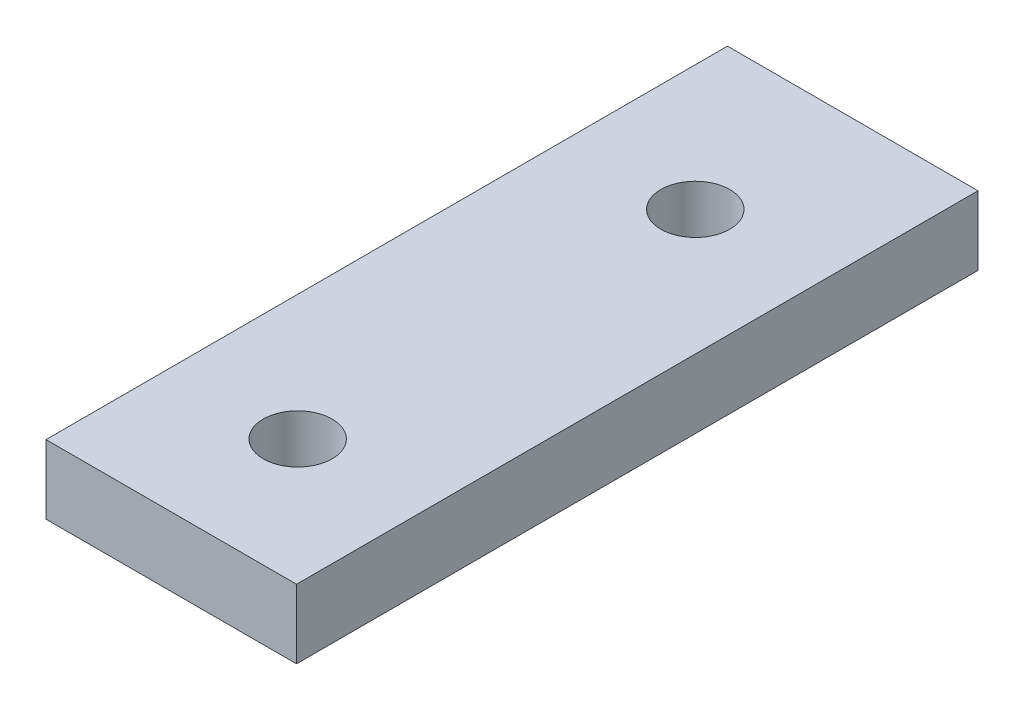
ISO-10303-21;
HEADER;
FILE_DESCRIPTION(('STEP AP214'),'2;1');
FILE_NAME('part.step','',(''),(''),'','','');
FILE_SCHEMA(('AUTOMOTIVE_DESIGN { 1 0 10303 214 1 1 1 1 }'));
ENDSEC;
DATA;
#1=APPLICATION_CONTEXT('core data for automotive mechanical design processes');
#2=APPLICATION_PROTOCOL_DEFINITION('international standard','automotive_design',2000,#1);
#3=PRODUCT_CONTEXT('',#1,'mechanical');
#4=PRODUCT('Part','Part','',(#3));
#5=PRODUCT_RELATED_PRODUCT_CATEGORY('part','',(#4));
#6=PRODUCT_DEFINITION_FORMATION('','',#4);
#7=PRODUCT_DEFINITION_CONTEXT('part definition',#1,'design');
#8=PRODUCT_DEFINITION('design','',#6,#7);
#9=PRODUCT_DEFINITION_SHAPE('','',#8);
#10=(LENGTH_UNIT() NAMED_UNIT(*) SI_UNIT(.MILLI.,.METRE.));
#11=(NAMED_UNIT(*) PLANE_ANGLE_UNIT() SI_UNIT($,.RADIAN.));
#12=(NAMED_UNIT(*) SI_UNIT($,.STERADIAN.) SOLID_ANGLE_UNIT());
#13=UNCERTAINTY_MEASURE_WITH_UNIT(LENGTH_MEASURE(1.E-05),#10,'distance_accuracy_value','');
#14=(GEOMETRIC_REPRESENTATION_CONTEXT(3) GLOBAL_UNCERTAINTY_ASSIGNED_CONTEXT((#13)) GLOBAL_UNIT_ASSIGNED_CONTEXT((#10,
#11,#12)) REPRESENTATION_CONTEXT('',''));
#15=CARTESIAN_POINT('',(0.,0.,0.));
#16=DIRECTION('',(0.,0.,1.));
#17=DIRECTION('',(1.,0.,0.));
#18=AXIS2_PLACEMENT_3D('',#15,#16,#17);
#19=CARTESIAN_POINT('',(0.,3.,0.));
#20=DIRECTION('',(0.,1.,0.));
#21=DIRECTION('',(0.,0.,1.));
#22=AXIS2_PLACEMENT_3D('',#19,#20,#21);
#23=PLANE('',#22);
#24=CARTESIAN_POINT('',(165.889139144495,3.,-77.6649999999999));
#25=DIRECTION('',(0.,1.,0.));
#26=DIRECTION('',(0.,0.,1.));
#27=AXIS2_PLACEMENT_3D('',#24,#25,#26);
#28=CIRCLE('',#27,1.5);
#29=CARTESIAN_POINT('',(165.889139144495,3.,-76.1649999999999));
#30=VERTEX_POINT('',#29);
#31=EDGE_CURVE('E98',#30,#30,#28,.T.);
#32=ORIENTED_EDGE('',*,*,#31,.F.);
#33=EDGE_LOOP('',(#32));
#34=FACE_BOUND('',#33,.T.);
#35=DIRECTION('',(0.,0.,-1.));
#36=VECTOR('',#35,1.);
#37=CARTESIAN_POINT('',(171.339139144495,3.,-57.8649999999999));
#38=LINE('',#37,#36);
#39=CARTESIAN_POINT('',(171.339139144495,3.,-54.865));
#40=VERTEX_POINT('',#39);
#41=CARTESIAN_POINT('',(171.339139144495,3.,-84.515));
#42=VERTEX_POINT('',#41);
#43=EDGE_CURVE('E77',#40,#42,#38,.T.);
#44=ORIENTED_EDGE('',*,*,#43,.T.);
#45=DIRECTION('',(-1.,0.,0.));
#46=VECTOR('',#45,1.);
#47=CARTESIAN_POINT('',(160.439139144495,3.,-84.515));
#48=LINE('',#47,#46);
#49=CARTESIAN_POINT('',(160.439139144495,3.,-84.515));
#50=VERTEX_POINT('',#49);
#51=EDGE_CURVE('E80',#42,#50,#48,.T.);
#52=ORIENTED_EDGE('',*,*,#51,.T.);
#53=DIRECTION('',(0.,0.,1.));
#54=VECTOR('',#53,1.);
#55=CARTESIAN_POINT('',(160.439139144495,3.,-80.1649999999999));
#56=LINE('',#55,#54);
#57=CARTESIAN_POINT('',(160.439139144495,3.,-54.865));
#58=VERTEX_POINT('',#57);
#59=EDGE_CURVE('E84',#50,#58,#56,.T.);
#60=ORIENTED_EDGE('',*,*,#59,.T.);
#61=DIRECTION('',(1.,0.,0.));
#62=VECTOR('',#61,1.);
#63=CARTESIAN_POINT('',(160.439139144495,3.,-54.865));
#64=LINE('',#63,#62);
#65=EDGE_CURVE('E49',#58,#40,#64,.T.);
#66=ORIENTED_EDGE('',*,*,#65,.T.);
#67=EDGE_LOOP('',(#44,#52,#60,#66));
#68=FACE_BOUND('',#67,.T.);
#69=CARTESIAN_POINT('',(165.889139144495,3.,-60.3649999999999));
#70=DIRECTION('',(0.,1.,0.));
#71=DIRECTION('',(0.,0.,1.));
#72=AXIS2_PLACEMENT_3D('',#69,#70,#71);
#73=CIRCLE('',#72,1.5);
#74=CARTESIAN_POINT('',(165.889139144495,3.,-58.8649999999999));
#75=VERTEX_POINT('',#74);
#76=EDGE_CURVE('E119',#75,#75,#73,.T.);
#77=ORIENTED_EDGE('',*,*,#76,.F.);
#78=EDGE_LOOP('',(#77));
#79=FACE_BOUND('',#78,.T.);
#80=ADVANCED_FACE('F32',(#34,#68,#79),#23,.T.);
#81=CARTESIAN_POINT('',(0.,0.,0.));
#82=DIRECTION('',(0.,1.,0.));
#83=DIRECTION('',(0.,0.,1.));
#84=AXIS2_PLACEMENT_3D('',#81,#82,#83);
#85=PLANE('',#84);
#86=DIRECTION('',(0.,0.,-1.));
#87=VECTOR('',#86,1.);
#88=CARTESIAN_POINT('',(171.339139144495,0.,-80.1649999999999));
#89=LINE('',#88,#87);
#90=CARTESIAN_POINT('',(171.339139144495,0.,-54.865));
#91=VERTEX_POINT('',#90);
#92=CARTESIAN_POINT('',(171.339139144495,0.,-84.515));
#93=VERTEX_POINT('',#92);
#94=EDGE_CURVE('E72',#91,#93,#89,.T.);
#95=ORIENTED_EDGE('',*,*,#94,.F.);
#96=DIRECTION('',(1.,0.,0.));
#97=VECTOR('',#96,1.);
#98=CARTESIAN_POINT('',(160.439139144495,0.,-54.865));
#99=LINE('',#98,#97);
#100=CARTESIAN_POINT('',(160.439139144495,0.,-54.865));
#101=VERTEX_POINT('',#100);
#102=EDGE_CURVE('E101',#101,#91,#99,.T.);
#103=ORIENTED_EDGE('',*,*,#102,.F.);
#104=DIRECTION('',(0.,0.,1.));
#105=VECTOR('',#104,1.);
#106=CARTESIAN_POINT('',(160.439139144495,0.,-57.8649999999999));
#107=LINE('',#106,#105);
#108=CARTESIAN_POINT('',(160.439139144495,0.,-84.515));
#109=VERTEX_POINT('',#108);
#110=EDGE_CURVE('E65',#109,#101,#107,.T.);
#111=ORIENTED_EDGE('',*,*,#110,.F.);
#112=DIRECTION('',(-1.,0.,0.));
#113=VECTOR('',#112,1.);
#114=CARTESIAN_POINT('',(160.439139144495,0.,-84.515));
#115=LINE('',#114,#113);
#116=EDGE_CURVE('E89',#93,#109,#115,.T.);
#117=ORIENTED_EDGE('',*,*,#116,.F.);
#118=EDGE_LOOP('',(#95,#103,#111,#117));
#119=FACE_BOUND('',#118,.T.);
#120=CARTESIAN_POINT('',(165.889139144495,0.,-77.6649999999999));
#121=DIRECTION('',(0.,1.,0.));
#122=DIRECTION('',(0.,0.,1.));
#123=AXIS2_PLACEMENT_3D('',#120,#121,#122);
#124=CIRCLE('',#123,1.5);
#125=CARTESIAN_POINT('',(165.889139144495,0.,-76.1649999999999));
#126=VERTEX_POINT('',#125);
#127=EDGE_CURVE('E114',#126,#126,#124,.T.);
#128=ORIENTED_EDGE('',*,*,#127,.T.);
#129=EDGE_LOOP('',(#128));
#130=FACE_BOUND('',#129,.T.);
#131=CARTESIAN_POINT('',(165.889139144495,0.,-60.3649999999999));
#132=DIRECTION('',(0.,1.,0.));
#133=DIRECTION('',(0.,0.,1.));
#134=AXIS2_PLACEMENT_3D('',#131,#132,#133);
#135=CIRCLE('',#134,1.5);
#136=CARTESIAN_POINT('',(165.889139144495,0.,-58.8649999999999));
#137=VERTEX_POINT('',#136);
#138=EDGE_CURVE('E117',#137,#137,#135,.T.);
#139=ORIENTED_EDGE('',*,*,#138,.T.);
#140=EDGE_LOOP('',(#139));
#141=FACE_BOUND('',#140,.T.);
#142=ADVANCED_FACE('F107',(#119,#130,#141),#85,.F.);
#143=CARTESIAN_POINT('',(171.339139144495,3.,-80.1649999999999));
#144=DIRECTION('',(-1.,0.,0.));
#145=DIRECTION('',(0.,0.,1.));
#146=AXIS2_PLACEMENT_3D('',#143,#144,#145);
#147=PLANE('',#146);
#148=ORIENTED_EDGE('',*,*,#94,.T.);
#149=DIRECTION('',(0.,-1.,0.));
#150=VECTOR('',#149,1.);
#151=CARTESIAN_POINT('',(171.339139144495,3.,-84.515));
#152=LINE('',#151,#150);
#153=EDGE_CURVE('E11',#42,#93,#152,.T.);
#154=ORIENTED_EDGE('',*,*,#153,.F.);
#155=ORIENTED_EDGE('',*,*,#43,.F.);
#156=DIRECTION('',(0.,-1.,0.));
#157=VECTOR('',#156,1.);
#158=CARTESIAN_POINT('',(171.339139144495,3.,-54.865));
#159=LINE('',#158,#157);
#160=EDGE_CURVE('E93',#40,#91,#159,.T.);
#161=ORIENTED_EDGE('',*,*,#160,.T.);
#162=EDGE_LOOP('',(#148,#154,#155,#161));
#163=FACE_BOUND('',#162,.T.);
#164=ADVANCED_FACE('F34',(#163),#147,.F.);
#165=CARTESIAN_POINT('',(160.439139144495,3.,-84.515));
#166=DIRECTION('',(0.,0.,1.));
#167=DIRECTION('',(1.,0.,0.));
#168=AXIS2_PLACEMENT_3D('',#165,#166,#167);
#169=PLANE('',#168);
#170=ORIENTED_EDGE('',*,*,#116,.T.);
#171=DIRECTION('',(0.,-1.,0.));
#172=VECTOR('',#171,1.);
#173=CARTESIAN_POINT('',(160.439139144495,3.,-84.515));
#174=LINE('',#173,#172);
#175=EDGE_CURVE('E41',#50,#109,#174,.T.);
#176=ORIENTED_EDGE('',*,*,#175,.F.);
#177=ORIENTED_EDGE('',*,*,#51,.F.);
#178=ORIENTED_EDGE('',*,*,#153,.T.);
#179=EDGE_LOOP('',(#170,#176,#177,#178));
#180=FACE_BOUND('',#179,.T.);
#181=ADVANCED_FACE('F88',(#180),#169,.F.);
#182=CARTESIAN_POINT('',(160.439139144495,3.,-57.8649999999999));
#183=DIRECTION('',(1.,0.,0.));
#184=DIRECTION('',(0.,0.,-1.));
#185=AXIS2_PLACEMENT_3D('',#182,#183,#184);
#186=PLANE('',#185);
#187=ORIENTED_EDGE('',*,*,#110,.T.);
#188=DIRECTION('',(0.,-1.,0.));
#189=VECTOR('',#188,1.);
#190=CARTESIAN_POINT('',(160.439139144495,3.,-54.865));
#191=LINE('',#190,#189);
#192=EDGE_CURVE('E90',#58,#101,#191,.T.);
#193=ORIENTED_EDGE('',*,*,#192,.F.);
#194=ORIENTED_EDGE('',*,*,#59,.F.);
#195=ORIENTED_EDGE('',*,*,#175,.T.);
#196=EDGE_LOOP('',(#187,#193,#194,#195));
#197=FACE_BOUND('',#196,.T.);
#198=ADVANCED_FACE('F91',(#197),#186,.F.);
#199=CARTESIAN_POINT('',(160.439139144495,3.,-54.865));
#200=DIRECTION('',(0.,0.,-1.));
#201=DIRECTION('',(-1.,0.,0.));
#202=AXIS2_PLACEMENT_3D('',#199,#200,#201);
#203=PLANE('',#202);
#204=ORIENTED_EDGE('',*,*,#102,.T.);
#205=ORIENTED_EDGE('',*,*,#160,.F.);
#206=ORIENTED_EDGE('',*,*,#65,.F.);
#207=ORIENTED_EDGE('',*,*,#192,.T.);
#208=EDGE_LOOP('',(#204,#205,#206,#207));
#209=FACE_BOUND('',#208,.T.);
#210=ADVANCED_FACE('F106',(#209),#203,.F.);
#211=CARTESIAN_POINT('',(165.889139144495,3.,-77.6649999999999));
#212=DIRECTION('',(0.,-1.,0.));
#213=DIRECTION('',(0.,0.,-1.));
#214=AXIS2_PLACEMENT_3D('',#211,#212,#213);
#215=CYLINDRICAL_SURFACE('',#214,1.5);
#216=ORIENTED_EDGE('',*,*,#31,.T.);
#217=EDGE_LOOP('',(#216));
#218=FACE_BOUND('',#217,.T.);
#219=ORIENTED_EDGE('',*,*,#127,.F.);
#220=EDGE_LOOP('',(#219));
#221=FACE_BOUND('',#220,.T.);
#222=ADVANCED_FACE('F128',(#218,#221),#215,.F.);
#223=CARTESIAN_POINT('',(165.889139144495,3.,-60.3649999999999));
#224=DIRECTION('',(0.,-1.,0.));
#225=DIRECTION('',(0.,0.,-1.));
#226=AXIS2_PLACEMENT_3D('',#223,#224,#225);
#227=CYLINDRICAL_SURFACE('',#226,1.5);
#228=ORIENTED_EDGE('',*,*,#76,.T.);
#229=EDGE_LOOP('',(#228));
#230=FACE_BOUND('',#229,.T.);
#231=ORIENTED_EDGE('',*,*,#138,.F.);
#232=EDGE_LOOP('',(#231));
#233=FACE_BOUND('',#232,.T.);
#234=ADVANCED_FACE('F194',(#230,#233),#227,.F.);
#235=CLOSED_SHELL('',(#80,#142,#164,#181,#198,#210,#222,#234));
#236=MANIFOLD_SOLID_BREP('B2',#235);
#237=ADVANCED_BREP_SHAPE_REPRESENTATION('',(#18,#236),#14);
#238=SHAPE_DEFINITION_REPRESENTATION(#9,#237);
ENDSEC;
END-ISO-10303-21;
